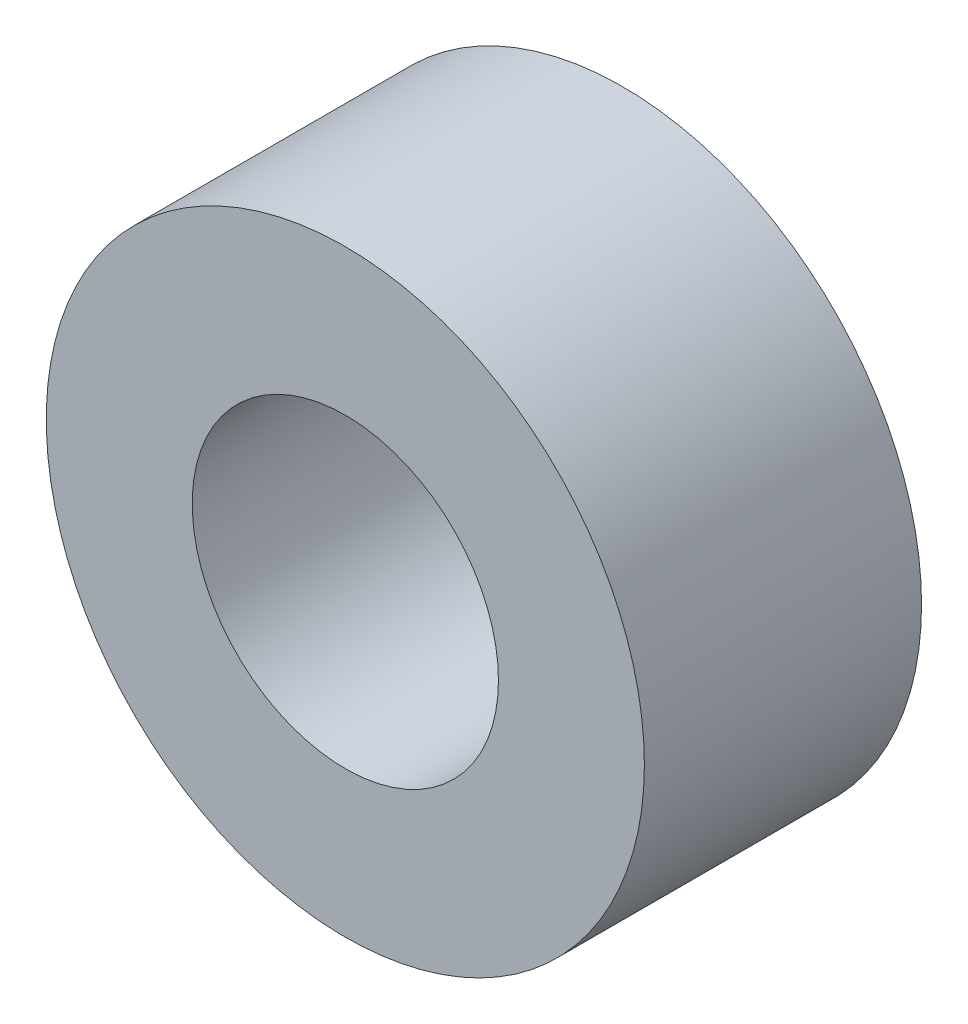
ISO-10303-21;
HEADER;
FILE_DESCRIPTION(('STEP AP214'),'2;1');
FILE_NAME('part.step','',(''),(''),'','','');
FILE_SCHEMA(('AUTOMOTIVE_DESIGN { 1 0 10303 214 1 1 1 1 }'));
ENDSEC;
DATA;
#1=APPLICATION_CONTEXT('core data for automotive mechanical design processes');
#2=APPLICATION_PROTOCOL_DEFINITION('international standard','automotive_design',2000,#1);
#3=PRODUCT_CONTEXT('',#1,'mechanical');
#4=PRODUCT('Part','Part','',(#3));
#5=PRODUCT_RELATED_PRODUCT_CATEGORY('part','',(#4));
#6=PRODUCT_DEFINITION_FORMATION('','',#4);
#7=PRODUCT_DEFINITION_CONTEXT('part definition',#1,'design');
#8=PRODUCT_DEFINITION('design','',#6,#7);
#9=PRODUCT_DEFINITION_SHAPE('','',#8);
#10=(LENGTH_UNIT() NAMED_UNIT(*) SI_UNIT(.MILLI.,.METRE.));
#11=(NAMED_UNIT(*) PLANE_ANGLE_UNIT() SI_UNIT($,.RADIAN.));
#12=(NAMED_UNIT(*) SI_UNIT($,.STERADIAN.) SOLID_ANGLE_UNIT());
#13=UNCERTAINTY_MEASURE_WITH_UNIT(LENGTH_MEASURE(1.E-05),#10,'distance_accuracy_value','');
#14=(GEOMETRIC_REPRESENTATION_CONTEXT(3) GLOBAL_UNCERTAINTY_ASSIGNED_CONTEXT((#13)) GLOBAL_UNIT_ASSIGNED_CONTEXT((#10,
#11,#12)) REPRESENTATION_CONTEXT('',''));
#15=CARTESIAN_POINT('',(0.,0.,0.));
#16=DIRECTION('',(0.,0.,1.));
#17=DIRECTION('',(1.,0.,0.));
#18=AXIS2_PLACEMENT_3D('',#15,#16,#17);
#19=CARTESIAN_POINT('',(0.,0.,0.));
#20=DIRECTION('',(0.,0.,1.));
#21=DIRECTION('',(1.,0.,0.));
#22=AXIS2_PLACEMENT_3D('',#19,#20,#21);
#23=CYLINDRICAL_SURFACE('',#22,3.2512);
#24=CARTESIAN_POINT('',(0.,0.,-6.392949876));
#25=DIRECTION('',(0.,0.,1.));
#26=DIRECTION('',(1.,0.,0.));
#27=AXIS2_PLACEMENT_3D('',#24,#25,#26);
#28=CIRCLE('',#27,3.2512);
#29=CARTESIAN_POINT('',(3.2512,0.,-6.392949876));
#30=VERTEX_POINT('',#29);
#31=EDGE_CURVE('E55',#30,#30,#28,.T.);
#32=ORIENTED_EDGE('',*,*,#31,.F.);
#33=EDGE_LOOP('',(#32));
#34=FACE_BOUND('',#33,.T.);
#35=CARTESIAN_POINT('',(0.,0.,0.));
#36=DIRECTION('',(0.,0.,1.));
#37=DIRECTION('',(1.,0.,0.));
#38=AXIS2_PLACEMENT_3D('',#35,#36,#37);
#39=CIRCLE('',#38,3.2512);
#40=CARTESIAN_POINT('',(3.2512,0.,0.));
#41=VERTEX_POINT('',#40);
#42=EDGE_CURVE('E10',#41,#41,#39,.T.);
#43=ORIENTED_EDGE('',*,*,#42,.T.);
#44=EDGE_LOOP('',(#43));
#45=FACE_BOUND('',#44,.T.);
#46=ADVANCED_FACE('F33',(#34,#45),#23,.F.);
#47=CARTESIAN_POINT('',(0.,3.2512,0.));
#48=DIRECTION('',(0.,0.,-1.));
#49=DIRECTION('',(-1.,0.,0.));
#50=AXIS2_PLACEMENT_3D('',#47,#48,#49);
#51=PLANE('',#50);
#52=ORIENTED_EDGE('',*,*,#42,.F.);
#53=EDGE_LOOP('',(#52));
#54=FACE_BOUND('',#53,.T.);
#55=CARTESIAN_POINT('',(0.,0.,0.));
#56=DIRECTION('',(0.,0.,1.));
#57=DIRECTION('',(1.,0.,0.));
#58=AXIS2_PLACEMENT_3D('',#55,#56,#57);
#59=CIRCLE('',#58,6.35);
#60=CARTESIAN_POINT('',(6.35,0.,0.));
#61=VERTEX_POINT('',#60);
#62=EDGE_CURVE('E39',#61,#61,#59,.T.);
#63=ORIENTED_EDGE('',*,*,#62,.T.);
#64=EDGE_LOOP('',(#63));
#65=FACE_BOUND('',#64,.T.);
#66=ADVANCED_FACE('F62',(#54,#65),#51,.F.);
#67=CARTESIAN_POINT('',(0.,0.,0.));
#68=DIRECTION('',(0.,0.,1.));
#69=DIRECTION('',(1.,0.,0.));
#70=AXIS2_PLACEMENT_3D('',#67,#68,#69);
#71=CYLINDRICAL_SURFACE('',#70,6.35);
#72=ORIENTED_EDGE('',*,*,#62,.F.);
#73=EDGE_LOOP('',(#72));
#74=FACE_BOUND('',#73,.T.);
#75=CARTESIAN_POINT('',(0.,0.,-5.884949876));
#76=DIRECTION('',(0.,0.,1.));
#77=DIRECTION('',(1.,0.,0.));
#78=AXIS2_PLACEMENT_3D('',#75,#76,#77);
#79=CIRCLE('',#78,6.35);
#80=CARTESIAN_POINT('',(6.35,0.,-5.884949876));
#81=VERTEX_POINT('',#80);
#82=EDGE_CURVE('E43',#81,#81,#79,.T.);
#83=ORIENTED_EDGE('',*,*,#82,.T.);
#84=EDGE_LOOP('',(#83));
#85=FACE_BOUND('',#84,.T.);
#86=ADVANCED_FACE('F66',(#74,#85),#71,.T.);
#87=CARTESIAN_POINT('',(0.,6.35,-5.884949876));
#88=DIRECTION('',(0.,0.,1.));
#89=DIRECTION('',(1.,0.,0.));
#90=AXIS2_PLACEMENT_3D('',#87,#88,#89);
#91=PLANE('',#90);
#92=ORIENTED_EDGE('',*,*,#82,.F.);
#93=EDGE_LOOP('',(#92));
#94=FACE_BOUND('',#93,.T.);
#95=CARTESIAN_POINT('',(0.,0.,-5.884949876));
#96=DIRECTION('',(0.,0.,1.));
#97=DIRECTION('',(1.,0.,0.));
#98=AXIS2_PLACEMENT_3D('',#95,#96,#97);
#99=CIRCLE('',#98,4.6736);
#100=CARTESIAN_POINT('',(4.6736,0.,-5.884949876));
#101=VERTEX_POINT('',#100);
#102=EDGE_CURVE('E47',#101,#101,#99,.T.);
#103=ORIENTED_EDGE('',*,*,#102,.T.);
#104=EDGE_LOOP('',(#103));
#105=FACE_BOUND('',#104,.T.);
#106=ADVANCED_FACE('F71',(#94,#105),#91,.F.);
#107=CARTESIAN_POINT('',(0.,0.,0.));
#108=DIRECTION('',(0.,0.,1.));
#109=DIRECTION('',(1.,0.,0.));
#110=AXIS2_PLACEMENT_3D('',#107,#108,#109);
#111=CYLINDRICAL_SURFACE('',#110,4.6736);
#112=ORIENTED_EDGE('',*,*,#102,.F.);
#113=EDGE_LOOP('',(#112));
#114=FACE_BOUND('',#113,.T.);
#115=CARTESIAN_POINT('',(0.,0.,-6.392949876));
#116=DIRECTION('',(0.,0.,1.));
#117=DIRECTION('',(1.,0.,0.));
#118=AXIS2_PLACEMENT_3D('',#115,#116,#117);
#119=CIRCLE('',#118,4.6736);
#120=CARTESIAN_POINT('',(4.6736,0.,-6.392949876));
#121=VERTEX_POINT('',#120);
#122=EDGE_CURVE('E52',#121,#121,#119,.T.);
#123=ORIENTED_EDGE('',*,*,#122,.T.);
#124=EDGE_LOOP('',(#123));
#125=FACE_BOUND('',#124,.T.);
#126=ADVANCED_FACE('F77',(#114,#125),#111,.T.);
#127=CARTESIAN_POINT('',(0.,4.6736,-6.392949876));
#128=DIRECTION('',(0.,0.,1.));
#129=DIRECTION('',(1.,0.,0.));
#130=AXIS2_PLACEMENT_3D('',#127,#128,#129);
#131=PLANE('',#130);
#132=ORIENTED_EDGE('',*,*,#122,.F.);
#133=EDGE_LOOP('',(#132));
#134=FACE_BOUND('',#133,.T.);
#135=ORIENTED_EDGE('',*,*,#31,.T.);
#136=EDGE_LOOP('',(#135));
#137=FACE_BOUND('',#136,.T.);
#138=ADVANCED_FACE('F59',(#134,#137),#131,.F.);
#139=CLOSED_SHELL('',(#46,#66,#86,#106,#126,#138));
#140=MANIFOLD_SOLID_BREP('B2',#139);
#141=ADVANCED_BREP_SHAPE_REPRESENTATION('',(#18,#140),#14);
#142=SHAPE_DEFINITION_REPRESENTATION(#9,#141);
ENDSEC;
END-ISO-10303-21;
